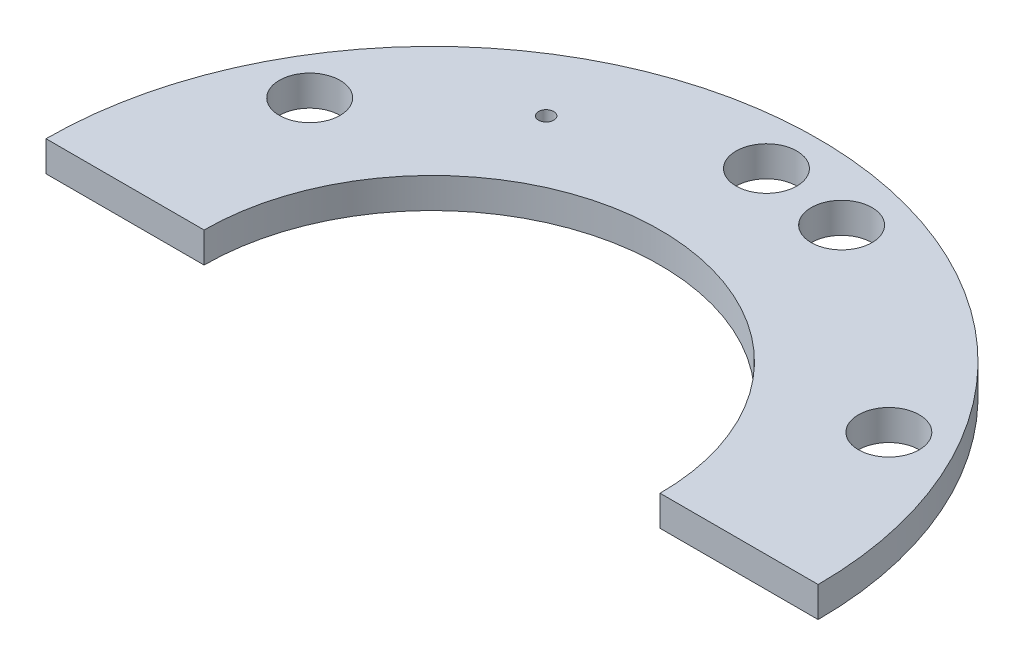
ISO-10303-21;
HEADER;
FILE_DESCRIPTION(('STEP AP214'),'2;1');
FILE_NAME('part.step','',(''),(''),'','','');
FILE_SCHEMA(('AUTOMOTIVE_DESIGN { 1 0 10303 214 1 1 1 1 }'));
ENDSEC;
DATA;
#1=APPLICATION_CONTEXT('core data for automotive mechanical design processes');
#2=APPLICATION_PROTOCOL_DEFINITION('international standard','automotive_design',2000,#1);
#3=PRODUCT_CONTEXT('',#1,'mechanical');
#4=PRODUCT('Part','Part','',(#3));
#5=PRODUCT_RELATED_PRODUCT_CATEGORY('part','',(#4));
#6=PRODUCT_DEFINITION_FORMATION('','',#4);
#7=PRODUCT_DEFINITION_CONTEXT('part definition',#1,'design');
#8=PRODUCT_DEFINITION('design','',#6,#7);
#9=PRODUCT_DEFINITION_SHAPE('','',#8);
#10=(LENGTH_UNIT() NAMED_UNIT(*) SI_UNIT(.MILLI.,.METRE.));
#11=(NAMED_UNIT(*) PLANE_ANGLE_UNIT() SI_UNIT($,.RADIAN.));
#12=(NAMED_UNIT(*) SI_UNIT($,.STERADIAN.) SOLID_ANGLE_UNIT());
#13=UNCERTAINTY_MEASURE_WITH_UNIT(LENGTH_MEASURE(1.E-05),#10,'distance_accuracy_value','');
#14=(GEOMETRIC_REPRESENTATION_CONTEXT(3) GLOBAL_UNCERTAINTY_ASSIGNED_CONTEXT((#13)) GLOBAL_UNIT_ASSIGNED_CONTEXT((#10,
#11,#12)) REPRESENTATION_CONTEXT('',''));
#15=CARTESIAN_POINT('',(0.,0.,0.));
#16=DIRECTION('',(0.,0.,1.));
#17=DIRECTION('',(1.,0.,0.));
#18=AXIS2_PLACEMENT_3D('',#15,#16,#17);
#19=CARTESIAN_POINT('',(0.,1.,0.));
#20=DIRECTION('',(0.,-1.,0.));
#21=DIRECTION('',(0.,0.,-1.));
#22=AXIS2_PLACEMENT_3D('',#19,#20,#21);
#23=CYLINDRICAL_SURFACE('',#22,12.7);
#24=DIRECTION('',(0.,-1.,0.));
#25=VECTOR('',#24,1.);
#26=CARTESIAN_POINT('',(-12.7,1.,0.));
#27=LINE('',#26,#25);
#28=CARTESIAN_POINT('',(-12.7,1.,0.));
#29=VERTEX_POINT('',#28);
#30=CARTESIAN_POINT('',(-12.7,0.,0.));
#31=VERTEX_POINT('',#30);
#32=EDGE_CURVE('E85',#29,#31,#27,.T.);
#33=ORIENTED_EDGE('',*,*,#32,.F.);
#34=CARTESIAN_POINT('',(0.,1.,0.));
#35=DIRECTION('',(0.,1.,0.));
#36=DIRECTION('',(0.,0.,1.));
#37=AXIS2_PLACEMENT_3D('',#34,#35,#36);
#38=CIRCLE('',#37,12.7);
#39=CARTESIAN_POINT('',(12.7,1.,0.));
#40=VERTEX_POINT('',#39);
#41=EDGE_CURVE('E78',#40,#29,#38,.T.);
#42=ORIENTED_EDGE('',*,*,#41,.F.);
#43=DIRECTION('',(0.,-1.,0.));
#44=VECTOR('',#43,1.);
#45=CARTESIAN_POINT('',(12.7,1.,0.));
#46=LINE('',#45,#44);
#47=CARTESIAN_POINT('',(12.7,0.,0.));
#48=VERTEX_POINT('',#47);
#49=EDGE_CURVE('E94',#48,#40,#46,.F.);
#50=ORIENTED_EDGE('',*,*,#49,.F.);
#51=CARTESIAN_POINT('',(0.,0.,0.));
#52=DIRECTION('',(0.,1.,0.));
#53=DIRECTION('',(0.,0.,1.));
#54=AXIS2_PLACEMENT_3D('',#51,#52,#53);
#55=CIRCLE('',#54,12.7);
#56=EDGE_CURVE('E112',#48,#31,#55,.T.);
#57=ORIENTED_EDGE('',*,*,#56,.T.);
#58=EDGE_LOOP('',(#33,#42,#50,#57));
#59=FACE_BOUND('',#58,.T.);
#60=ADVANCED_FACE('F34',(#59),#23,.T.);
#61=CARTESIAN_POINT('',(0.,1.,0.));
#62=DIRECTION('',(0.,1.,0.));
#63=DIRECTION('',(0.,0.,1.));
#64=AXIS2_PLACEMENT_3D('',#61,#62,#63);
#65=PLANE('',#64);
#66=CARTESIAN_POINT('',(-5.125,1.,-8.8767603887905));
#67=DIRECTION('',(0.,1.,0.));
#68=DIRECTION('',(0.,0.,1.));
#69=AXIS2_PLACEMENT_3D('',#66,#67,#68);
#70=CIRCLE('',#69,0.25);
#71=CARTESIAN_POINT('',(-5.125,1.,-8.6267603887905));
#72=VERTEX_POINT('',#71);
#73=EDGE_CURVE('E122',#72,#72,#70,.T.);
#74=ORIENTED_EDGE('',*,*,#73,.F.);
#75=EDGE_LOOP('',(#74));
#76=FACE_BOUND('',#75,.T.);
#77=CARTESIAN_POINT('',(2.84700949612767,1.,-10.6251840891798));
#78=DIRECTION('',(0.,1.,0.));
#79=DIRECTION('',(0.,0.,1.));
#80=AXIS2_PLACEMENT_3D('',#77,#78,#79);
#81=CIRCLE('',#80,1.);
#82=CARTESIAN_POINT('',(2.84700949612767,1.,-9.62518408917977));
#83=VERTEX_POINT('',#82);
#84=EDGE_CURVE('E125',#83,#83,#81,.T.);
#85=ORIENTED_EDGE('',*,*,#84,.F.);
#86=EDGE_LOOP('',(#85));
#87=FACE_BOUND('',#86,.T.);
#88=CARTESIAN_POINT('',(-9.5262794416286,1.,-5.49999999999959));
#89=DIRECTION('',(0.,1.,0.));
#90=DIRECTION('',(0.,0.,1.));
#91=AXIS2_PLACEMENT_3D('',#88,#89,#90);
#92=CIRCLE('',#91,1.00000000000047);
#93=CARTESIAN_POINT('',(-9.5262794416286,1.,-4.49999999999912));
#94=VERTEX_POINT('',#93);
#95=EDGE_CURVE('E101',#94,#94,#92,.T.);
#96=ORIENTED_EDGE('',*,*,#95,.F.);
#97=EDGE_LOOP('',(#96));
#98=FACE_BOUND('',#97,.T.);
#99=CARTESIAN_POINT('',(9.52627944162914,1.,-5.50000000000035));
#100=DIRECTION('',(0.,1.,0.));
#101=DIRECTION('',(0.,0.,1.));
#102=AXIS2_PLACEMENT_3D('',#99,#100,#101);
#103=CIRCLE('',#102,1.00000000000019);
#104=CARTESIAN_POINT('',(9.52627944162914,1.,-4.50000000000015));
#105=VERTEX_POINT('',#104);
#106=EDGE_CURVE('E106',#105,#105,#103,.T.);
#107=ORIENTED_EDGE('',*,*,#106,.F.);
#108=EDGE_LOOP('',(#107));
#109=FACE_BOUND('',#108,.T.);
#110=CARTESIAN_POINT('',(0.,1.,-11.));
#111=DIRECTION('',(0.,1.,0.));
#112=DIRECTION('',(0.,0.,1.));
#113=AXIS2_PLACEMENT_3D('',#110,#111,#112);
#114=CIRCLE('',#113,1.);
#115=CARTESIAN_POINT('',(0.,1.,-10.));
#116=VERTEX_POINT('',#115);
#117=EDGE_CURVE('E109',#116,#116,#114,.T.);
#118=ORIENTED_EDGE('',*,*,#117,.F.);
#119=EDGE_LOOP('',(#118));
#120=FACE_BOUND('',#119,.T.);
#121=ORIENTED_EDGE('',*,*,#41,.T.);
#122=DIRECTION('',(1.,0.,0.));
#123=VECTOR('',#122,1.);
#124=CARTESIAN_POINT('',(0.,1.,0.));
#125=LINE('',#124,#123);
#126=CARTESIAN_POINT('',(-7.5,1.,0.));
#127=VERTEX_POINT('',#126);
#128=EDGE_CURVE('E72',#29,#127,#125,.T.);
#129=ORIENTED_EDGE('',*,*,#128,.T.);
#130=CARTESIAN_POINT('',(0.,1.,0.));
#131=DIRECTION('',(0.,1.,0.));
#132=DIRECTION('',(0.,0.,1.));
#133=AXIS2_PLACEMENT_3D('',#130,#131,#132);
#134=CIRCLE('',#133,7.5);
#135=CARTESIAN_POINT('',(7.5,1.,0.));
#136=VERTEX_POINT('',#135);
#137=EDGE_CURVE('E83',#136,#127,#134,.T.);
#138=ORIENTED_EDGE('',*,*,#137,.F.);
#139=EDGE_CURVE('E55',#136,#40,#125,.T.);
#140=ORIENTED_EDGE('',*,*,#139,.T.);
#141=EDGE_LOOP('',(#121,#129,#138,#140));
#142=FACE_BOUND('',#141,.T.);
#143=ADVANCED_FACE('F82',(#76,#87,#98,#109,#120,#142),#65,.T.);
#144=CARTESIAN_POINT('',(0.,0.,0.));
#145=DIRECTION('',(0.,1.,0.));
#146=DIRECTION('',(0.,0.,1.));
#147=AXIS2_PLACEMENT_3D('',#144,#145,#146);
#148=PLANE('',#147);
#149=CARTESIAN_POINT('',(-5.125,0.,-8.8767603887905));
#150=DIRECTION('',(0.,1.,0.));
#151=DIRECTION('',(0.,0.,1.));
#152=AXIS2_PLACEMENT_3D('',#149,#150,#151);
#153=CIRCLE('',#152,0.25);
#154=CARTESIAN_POINT('',(-5.125,0.,-8.6267603887905));
#155=VERTEX_POINT('',#154);
#156=EDGE_CURVE('E220',#155,#155,#153,.T.);
#157=ORIENTED_EDGE('',*,*,#156,.T.);
#158=EDGE_LOOP('',(#157));
#159=FACE_BOUND('',#158,.T.);
#160=CARTESIAN_POINT('',(2.84700949612767,0.,-10.6251840891798));
#161=DIRECTION('',(0.,1.,0.));
#162=DIRECTION('',(0.,0.,1.));
#163=AXIS2_PLACEMENT_3D('',#160,#161,#162);
#164=CIRCLE('',#163,1.);
#165=CARTESIAN_POINT('',(2.84700949612767,0.,-9.62518408917977));
#166=VERTEX_POINT('',#165);
#167=EDGE_CURVE('E221',#166,#166,#164,.T.);
#168=ORIENTED_EDGE('',*,*,#167,.T.);
#169=EDGE_LOOP('',(#168));
#170=FACE_BOUND('',#169,.T.);
#171=CARTESIAN_POINT('',(-9.5262794416286,0.,-5.49999999999959));
#172=DIRECTION('',(0.,1.,0.));
#173=DIRECTION('',(0.,0.,1.));
#174=AXIS2_PLACEMENT_3D('',#171,#172,#173);
#175=CIRCLE('',#174,1.00000000000047);
#176=CARTESIAN_POINT('',(-9.5262794416286,0.,-4.49999999999912));
#177=VERTEX_POINT('',#176);
#178=EDGE_CURVE('E92',#177,#177,#175,.T.);
#179=ORIENTED_EDGE('',*,*,#178,.T.);
#180=EDGE_LOOP('',(#179));
#181=FACE_BOUND('',#180,.T.);
#182=CARTESIAN_POINT('',(9.52627944162914,0.,-5.50000000000035));
#183=DIRECTION('',(0.,1.,0.));
#184=DIRECTION('',(0.,0.,1.));
#185=AXIS2_PLACEMENT_3D('',#182,#183,#184);
#186=CIRCLE('',#185,1.00000000000019);
#187=CARTESIAN_POINT('',(9.52627944162914,0.,-4.50000000000015));
#188=VERTEX_POINT('',#187);
#189=EDGE_CURVE('E88',#188,#188,#186,.T.);
#190=ORIENTED_EDGE('',*,*,#189,.T.);
#191=EDGE_LOOP('',(#190));
#192=FACE_BOUND('',#191,.T.);
#193=CARTESIAN_POINT('',(0.,0.,-11.));
#194=DIRECTION('',(0.,1.,0.));
#195=DIRECTION('',(0.,0.,1.));
#196=AXIS2_PLACEMENT_3D('',#193,#194,#195);
#197=CIRCLE('',#196,1.);
#198=CARTESIAN_POINT('',(0.,0.,-10.));
#199=VERTEX_POINT('',#198);
#200=EDGE_CURVE('E98',#199,#199,#197,.T.);
#201=ORIENTED_EDGE('',*,*,#200,.T.);
#202=EDGE_LOOP('',(#201));
#203=FACE_BOUND('',#202,.T.);
#204=DIRECTION('',(1.,0.,0.));
#205=VECTOR('',#204,1.);
#206=CARTESIAN_POINT('',(0.,0.,0.));
#207=LINE('',#206,#205);
#208=CARTESIAN_POINT('',(-7.5,0.,0.));
#209=VERTEX_POINT('',#208);
#210=EDGE_CURVE('E48',#31,#209,#207,.T.);
#211=ORIENTED_EDGE('',*,*,#210,.F.);
#212=ORIENTED_EDGE('',*,*,#56,.F.);
#213=CARTESIAN_POINT('',(7.5,0.,0.));
#214=VERTEX_POINT('',#213);
#215=EDGE_CURVE('E121',#214,#48,#207,.T.);
#216=ORIENTED_EDGE('',*,*,#215,.F.);
#217=CARTESIAN_POINT('',(0.,0.,0.));
#218=DIRECTION('',(0.,1.,0.));
#219=DIRECTION('',(0.,0.,1.));
#220=AXIS2_PLACEMENT_3D('',#217,#218,#219);
#221=CIRCLE('',#220,7.5);
#222=EDGE_CURVE('E89',#214,#209,#221,.T.);
#223=ORIENTED_EDGE('',*,*,#222,.T.);
#224=EDGE_LOOP('',(#211,#212,#216,#223));
#225=FACE_BOUND('',#224,.T.);
#226=ADVANCED_FACE('F120',(#159,#170,#181,#192,#203,#225),#148,.F.);
#227=CARTESIAN_POINT('',(0.,0.,0.));
#228=DIRECTION('',(0.,1.,0.));
#229=DIRECTION('',(0.,0.,1.));
#230=AXIS2_PLACEMENT_3D('',#227,#228,#229);
#231=CYLINDRICAL_SURFACE('',#230,7.5);
#232=DIRECTION('',(0.,1.,0.));
#233=VECTOR('',#232,1.);
#234=CARTESIAN_POINT('',(7.5,0.,0.));
#235=LINE('',#234,#233);
#236=EDGE_CURVE('E11',#136,#214,#235,.F.);
#237=ORIENTED_EDGE('',*,*,#236,.F.);
#238=ORIENTED_EDGE('',*,*,#137,.T.);
#239=DIRECTION('',(0.,1.,0.));
#240=VECTOR('',#239,1.);
#241=CARTESIAN_POINT('',(-7.5,0.,0.));
#242=LINE('',#241,#240);
#243=EDGE_CURVE('E41',#209,#127,#242,.T.);
#244=ORIENTED_EDGE('',*,*,#243,.F.);
#245=ORIENTED_EDGE('',*,*,#222,.F.);
#246=EDGE_LOOP('',(#237,#238,#244,#245));
#247=FACE_BOUND('',#246,.T.);
#248=ADVANCED_FACE('F87',(#247),#231,.F.);
#249=CARTESIAN_POINT('',(-9.5262794416286,0.,-5.49999999999959));
#250=DIRECTION('',(0.,1.,0.));
#251=DIRECTION('',(0.,0.,1.));
#252=AXIS2_PLACEMENT_3D('',#249,#250,#251);
#253=CYLINDRICAL_SURFACE('',#252,1.00000000000047);
#254=ORIENTED_EDGE('',*,*,#95,.T.);
#255=EDGE_LOOP('',(#254));
#256=FACE_BOUND('',#255,.T.);
#257=ORIENTED_EDGE('',*,*,#178,.F.);
#258=EDGE_LOOP('',(#257));
#259=FACE_BOUND('',#258,.T.);
#260=ADVANCED_FACE('F157',(#256,#259),#253,.F.);
#261=CARTESIAN_POINT('',(9.52627944162914,0.,-5.50000000000035));
#262=DIRECTION('',(0.,1.,0.));
#263=DIRECTION('',(0.,0.,1.));
#264=AXIS2_PLACEMENT_3D('',#261,#262,#263);
#265=CYLINDRICAL_SURFACE('',#264,1.00000000000019);
#266=ORIENTED_EDGE('',*,*,#106,.T.);
#267=EDGE_LOOP('',(#266));
#268=FACE_BOUND('',#267,.T.);
#269=ORIENTED_EDGE('',*,*,#189,.F.);
#270=EDGE_LOOP('',(#269));
#271=FACE_BOUND('',#270,.T.);
#272=ADVANCED_FACE('F154',(#268,#271),#265,.F.);
#273=CARTESIAN_POINT('',(0.,0.,-11.));
#274=DIRECTION('',(0.,1.,0.));
#275=DIRECTION('',(0.,0.,1.));
#276=AXIS2_PLACEMENT_3D('',#273,#274,#275);
#277=CYLINDRICAL_SURFACE('',#276,1.);
#278=ORIENTED_EDGE('',*,*,#117,.T.);
#279=EDGE_LOOP('',(#278));
#280=FACE_BOUND('',#279,.T.);
#281=ORIENTED_EDGE('',*,*,#200,.F.);
#282=EDGE_LOOP('',(#281));
#283=FACE_BOUND('',#282,.T.);
#284=ADVANCED_FACE('F139',(#280,#283),#277,.F.);
#285=CARTESIAN_POINT('',(0.,0.,0.));
#286=DIRECTION('',(0.,0.,1.));
#287=DIRECTION('',(1.,0.,0.));
#288=AXIS2_PLACEMENT_3D('',#285,#286,#287);
#289=PLANE('',#288);
#290=ORIENTED_EDGE('',*,*,#32,.T.);
#291=ORIENTED_EDGE('',*,*,#210,.T.);
#292=ORIENTED_EDGE('',*,*,#243,.T.);
#293=ORIENTED_EDGE('',*,*,#128,.F.);
#294=EDGE_LOOP('',(#290,#291,#292,#293));
#295=FACE_BOUND('',#294,.T.);
#296=ADVANCED_FACE('F71',(#295),#289,.T.);
#297=ORIENTED_EDGE('',*,*,#49,.T.);
#298=ORIENTED_EDGE('',*,*,#139,.F.);
#299=ORIENTED_EDGE('',*,*,#236,.T.);
#300=ORIENTED_EDGE('',*,*,#215,.T.);
#301=EDGE_LOOP('',(#297,#298,#299,#300));
#302=FACE_BOUND('',#301,.T.);
#303=ADVANCED_FACE('F128',(#302),#289,.T.);
#304=CARTESIAN_POINT('',(2.84700949612767,0.,-10.6251840891798));
#305=DIRECTION('',(0.,1.,0.));
#306=DIRECTION('',(0.,0.,1.));
#307=AXIS2_PLACEMENT_3D('',#304,#305,#306);
#308=CYLINDRICAL_SURFACE('',#307,1.);
#309=ORIENTED_EDGE('',*,*,#84,.T.);
#310=EDGE_LOOP('',(#309));
#311=FACE_BOUND('',#310,.T.);
#312=ORIENTED_EDGE('',*,*,#167,.F.);
#313=EDGE_LOOP('',(#312));
#314=FACE_BOUND('',#313,.T.);
#315=ADVANCED_FACE('F130',(#311,#314),#308,.F.);
#316=CARTESIAN_POINT('',(-5.125,0.,-8.8767603887905));
#317=DIRECTION('',(0.,1.,0.));
#318=DIRECTION('',(0.,0.,1.));
#319=AXIS2_PLACEMENT_3D('',#316,#317,#318);
#320=CYLINDRICAL_SURFACE('',#319,0.25);
#321=ORIENTED_EDGE('',*,*,#73,.T.);
#322=EDGE_LOOP('',(#321));
#323=FACE_BOUND('',#322,.T.);
#324=ORIENTED_EDGE('',*,*,#156,.F.);
#325=EDGE_LOOP('',(#324));
#326=FACE_BOUND('',#325,.T.);
#327=ADVANCED_FACE('F136',(#323,#326),#320,.F.);
#328=CLOSED_SHELL('',(#60,#143,#226,#248,#260,#272,#284,#296,#303,#315,#327));
#329=MANIFOLD_SOLID_BREP('B2',#328);
#330=ADVANCED_BREP_SHAPE_REPRESENTATION('',(#18,#329),#14);
#331=SHAPE_DEFINITION_REPRESENTATION(#9,#330);
ENDSEC;
END-ISO-10303-21;
